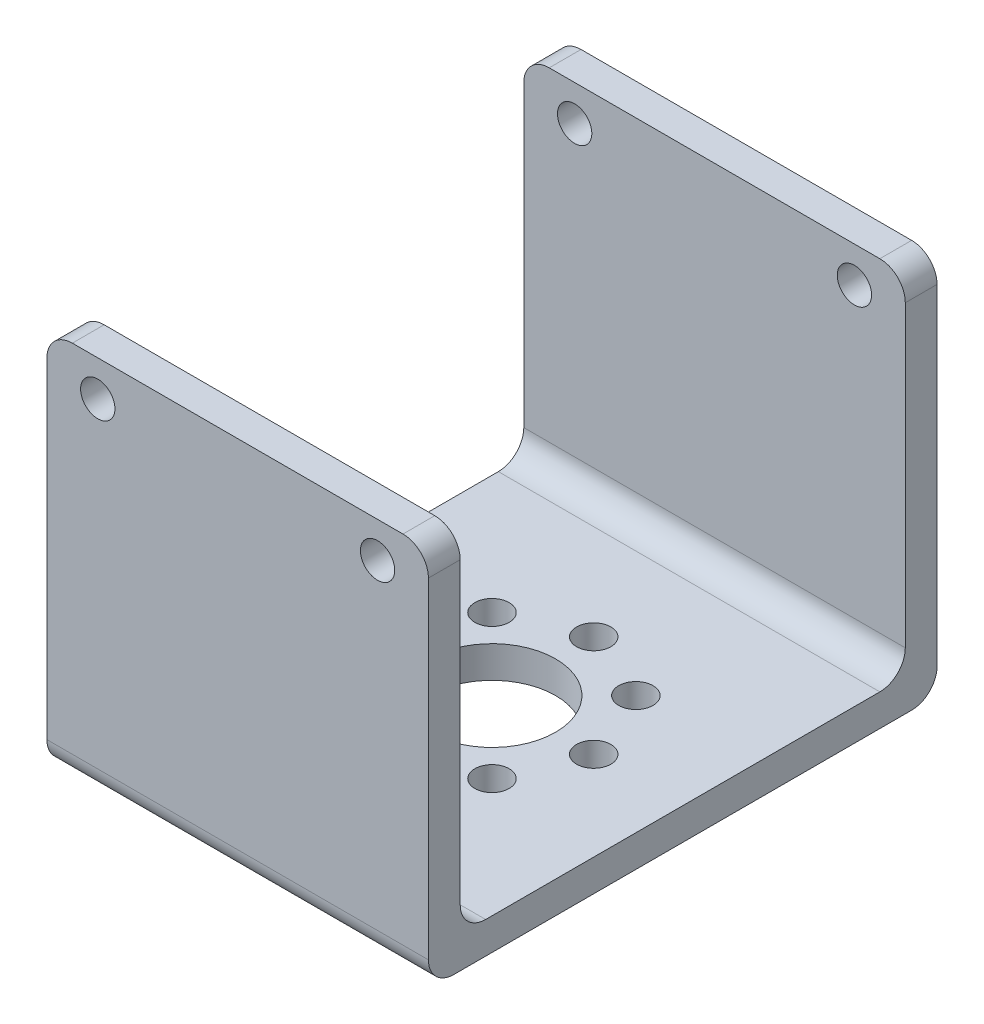
ISO-10303-21;
HEADER;
FILE_DESCRIPTION(('STEP AP214'),'2;1');
FILE_NAME('part.step','',(''),(''),'','','');
FILE_SCHEMA(('AUTOMOTIVE_DESIGN { 1 0 10303 214 1 1 1 1 }'));
ENDSEC;
DATA;
#1=APPLICATION_CONTEXT('core data for automotive mechanical design processes');
#2=APPLICATION_PROTOCOL_DEFINITION('international standard','automotive_design',2000,#1);
#3=PRODUCT_CONTEXT('',#1,'mechanical');
#4=PRODUCT('Part','Part','',(#3));
#5=PRODUCT_RELATED_PRODUCT_CATEGORY('part','',(#4));
#6=PRODUCT_DEFINITION_FORMATION('','',#4);
#7=PRODUCT_DEFINITION_CONTEXT('part definition',#1,'design');
#8=PRODUCT_DEFINITION('design','',#6,#7);
#9=PRODUCT_DEFINITION_SHAPE('','',#8);
#10=(LENGTH_UNIT() NAMED_UNIT(*) SI_UNIT(.MILLI.,.METRE.));
#11=(NAMED_UNIT(*) PLANE_ANGLE_UNIT() SI_UNIT($,.RADIAN.));
#12=(NAMED_UNIT(*) SI_UNIT($,.STERADIAN.) SOLID_ANGLE_UNIT());
#13=UNCERTAINTY_MEASURE_WITH_UNIT(LENGTH_MEASURE(1.E-05),#10,'distance_accuracy_value','');
#14=(GEOMETRIC_REPRESENTATION_CONTEXT(3) GLOBAL_UNCERTAINTY_ASSIGNED_CONTEXT((#13)) GLOBAL_UNIT_ASSIGNED_CONTEXT((#10,
#11,#12)) REPRESENTATION_CONTEXT('',''));
#15=CARTESIAN_POINT('',(0.,0.,0.));
#16=DIRECTION('',(0.,0.,1.));
#17=DIRECTION('',(1.,0.,0.));
#18=AXIS2_PLACEMENT_3D('',#15,#16,#17);
#19=CARTESIAN_POINT('',(-15.,15.,40.));
#20=DIRECTION('',(0.,-1.,0.));
#21=DIRECTION('',(0.,0.,-1.));
#22=AXIS2_PLACEMENT_3D('',#19,#20,#21);
#23=PLANE('',#22);
#24=DIRECTION('',(-1.,0.,0.));
#25=VECTOR('',#24,1.);
#26=CARTESIAN_POINT('',(-15.,15.,40.));
#27=LINE('',#26,#25);
#28=CARTESIAN_POINT('',(13.,15.,40.));
#29=VERTEX_POINT('',#28);
#30=CARTESIAN_POINT('',(-13.,15.,40.));
#31=VERTEX_POINT('',#30);
#32=EDGE_CURVE('E402',#29,#31,#27,.T.);
#33=ORIENTED_EDGE('',*,*,#32,.F.);
#34=DIRECTION('',(0.,0.,-1.));
#35=VECTOR('',#34,1.);
#36=CARTESIAN_POINT('',(13.,15.,40.));
#37=LINE('',#36,#35);
#38=CARTESIAN_POINT('',(13.,15.,37.5));
#39=VERTEX_POINT('',#38);
#40=EDGE_CURVE('E170',#29,#39,#37,.T.);
#41=ORIENTED_EDGE('',*,*,#40,.T.);
#42=DIRECTION('',(1.,0.,0.));
#43=VECTOR('',#42,1.);
#44=CARTESIAN_POINT('',(-25.,15.,37.5));
#45=LINE('',#44,#43);
#46=CARTESIAN_POINT('',(-13.,15.,37.5));
#47=VERTEX_POINT('',#46);
#48=EDGE_CURVE('E161',#47,#39,#45,.T.);
#49=ORIENTED_EDGE('',*,*,#48,.F.);
#50=DIRECTION('',(0.,0.,-1.));
#51=VECTOR('',#50,1.);
#52=CARTESIAN_POINT('',(-13.,15.,40.));
#53=LINE('',#52,#51);
#54=EDGE_CURVE('E175',#47,#31,#53,.F.);
#55=ORIENTED_EDGE('',*,*,#54,.T.);
#56=EDGE_LOOP('',(#33,#41,#49,#55));
#57=FACE_BOUND('',#56,.T.);
#58=ADVANCED_FACE('F39',(#57),#23,.F.);
#59=CARTESIAN_POINT('',(15.,15.,40.));
#60=DIRECTION('',(-1.,0.,0.));
#61=DIRECTION('',(0.,-1.,0.));
#62=AXIS2_PLACEMENT_3D('',#59,#60,#61);
#63=PLANE('',#62);
#64=DIRECTION('',(0.,1.,0.));
#65=VECTOR('',#64,1.);
#66=CARTESIAN_POINT('',(15.,15.,40.));
#67=LINE('',#66,#65);
#68=CARTESIAN_POINT('',(15.,-13.,40.));
#69=VERTEX_POINT('',#68);
#70=CARTESIAN_POINT('',(15.,13.,40.));
#71=VERTEX_POINT('',#70);
#72=EDGE_CURVE('E399',#69,#71,#67,.T.);
#73=ORIENTED_EDGE('',*,*,#72,.F.);
#74=CARTESIAN_POINT('',(15.,-13.,38.));
#75=DIRECTION('',(-1.,0.,0.));
#76=DIRECTION('',(0.,-1.,0.));
#77=AXIS2_PLACEMENT_3D('',#74,#75,#76);
#78=CIRCLE('',#77,2.);
#79=CARTESIAN_POINT('',(15.,-15.,38.));
#80=VERTEX_POINT('',#79);
#81=EDGE_CURVE('E258',#69,#80,#78,.F.);
#82=ORIENTED_EDGE('',*,*,#81,.T.);
#83=DIRECTION('',(0.,0.,-1.));
#84=VECTOR('',#83,1.);
#85=CARTESIAN_POINT('',(15.,-15.,40.));
#86=LINE('',#85,#84);
#87=CARTESIAN_POINT('',(15.,-15.,2.));
#88=VERTEX_POINT('',#87);
#89=EDGE_CURVE('E410',#80,#88,#86,.T.);
#90=ORIENTED_EDGE('',*,*,#89,.T.);
#91=CARTESIAN_POINT('',(15.,-13.,2.));
#92=DIRECTION('',(-1.,0.,0.));
#93=DIRECTION('',(0.,-1.,0.));
#94=AXIS2_PLACEMENT_3D('',#91,#92,#93);
#95=CIRCLE('',#94,2.);
#96=CARTESIAN_POINT('',(15.,-13.,0.));
#97=VERTEX_POINT('',#96);
#98=EDGE_CURVE('E255',#88,#97,#95,.F.);
#99=ORIENTED_EDGE('',*,*,#98,.T.);
#100=DIRECTION('',(0.,1.,0.));
#101=VECTOR('',#100,1.);
#102=CARTESIAN_POINT('',(15.,15.,0.));
#103=LINE('',#102,#101);
#104=CARTESIAN_POINT('',(15.,13.,0.));
#105=VERTEX_POINT('',#104);
#106=EDGE_CURVE('E179',#97,#105,#103,.T.);
#107=ORIENTED_EDGE('',*,*,#106,.T.);
#108=DIRECTION('',(0.,0.,-1.));
#109=VECTOR('',#108,1.);
#110=CARTESIAN_POINT('',(15.,13.,40.));
#111=LINE('',#110,#109);
#112=CARTESIAN_POINT('',(15.,13.,2.5));
#113=VERTEX_POINT('',#112);
#114=EDGE_CURVE('E196',#105,#113,#111,.F.);
#115=ORIENTED_EDGE('',*,*,#114,.T.);
#116=DIRECTION('',(0.,1.,0.));
#117=VECTOR('',#116,1.);
#118=CARTESIAN_POINT('',(15.,0.,2.5));
#119=LINE('',#118,#117);
#120=CARTESIAN_POINT('',(15.,-10.5,2.5));
#121=VERTEX_POINT('',#120);
#122=EDGE_CURVE('E390',#121,#113,#119,.T.);
#123=ORIENTED_EDGE('',*,*,#122,.F.);
#124=CARTESIAN_POINT('',(15.,-10.5,4.5));
#125=DIRECTION('',(-1.,0.,0.));
#126=DIRECTION('',(0.,-1.,0.));
#127=AXIS2_PLACEMENT_3D('',#124,#125,#126);
#128=CIRCLE('',#127,2.);
#129=CARTESIAN_POINT('',(15.,-12.5,4.5));
#130=VERTEX_POINT('',#129);
#131=EDGE_CURVE('E49',#121,#130,#128,.T.);
#132=ORIENTED_EDGE('',*,*,#131,.T.);
#133=DIRECTION('',(0.,0.,-1.));
#134=VECTOR('',#133,1.);
#135=CARTESIAN_POINT('',(15.,-12.5,0.));
#136=LINE('',#135,#134);
#137=CARTESIAN_POINT('',(15.,-12.5,35.5));
#138=VERTEX_POINT('',#137);
#139=EDGE_CURVE('E287',#138,#130,#136,.T.);
#140=ORIENTED_EDGE('',*,*,#139,.F.);
#141=CARTESIAN_POINT('',(15.,-10.5,35.5));
#142=DIRECTION('',(-1.,0.,0.));
#143=DIRECTION('',(0.,-1.,0.));
#144=AXIS2_PLACEMENT_3D('',#141,#142,#143);
#145=CIRCLE('',#144,2.);
#146=CARTESIAN_POINT('',(15.,-10.5,37.5));
#147=VERTEX_POINT('',#146);
#148=EDGE_CURVE('E275',#138,#147,#145,.T.);
#149=ORIENTED_EDGE('',*,*,#148,.T.);
#150=DIRECTION('',(0.,-1.,0.));
#151=VECTOR('',#150,1.);
#152=CARTESIAN_POINT('',(15.,0.,37.5));
#153=LINE('',#152,#151);
#154=CARTESIAN_POINT('',(15.,13.,37.5));
#155=VERTEX_POINT('',#154);
#156=EDGE_CURVE('E393',#155,#147,#153,.T.);
#157=ORIENTED_EDGE('',*,*,#156,.F.);
#158=DIRECTION('',(0.,0.,-1.));
#159=VECTOR('',#158,1.);
#160=CARTESIAN_POINT('',(15.,13.,40.));
#161=LINE('',#160,#159);
#162=EDGE_CURVE('E200',#155,#71,#161,.F.);
#163=ORIENTED_EDGE('',*,*,#162,.T.);
#164=EDGE_LOOP('',(#73,#82,#90,#99,#107,#115,#123,#132,#140,#149,#157,#163));
#165=FACE_BOUND('',#164,.T.);
#166=ADVANCED_FACE('F445',(#165),#63,.F.);
#167=DIRECTION('',(-1.,0.,0.));
#168=VECTOR('',#167,1.);
#169=CARTESIAN_POINT('',(-15.,15.,0.));
#170=LINE('',#169,#168);
#171=CARTESIAN_POINT('',(13.,15.,0.));
#172=VERTEX_POINT('',#171);
#173=CARTESIAN_POINT('',(-13.,15.,0.));
#174=VERTEX_POINT('',#173);
#175=EDGE_CURVE('E413',#172,#174,#170,.T.);
#176=ORIENTED_EDGE('',*,*,#175,.T.);
#177=DIRECTION('',(0.,0.,-1.));
#178=VECTOR('',#177,1.);
#179=CARTESIAN_POINT('',(-13.,15.,40.));
#180=LINE('',#179,#178);
#181=CARTESIAN_POINT('',(-13.,15.,2.5));
#182=VERTEX_POINT('',#181);
#183=EDGE_CURVE('E227',#174,#182,#180,.F.);
#184=ORIENTED_EDGE('',*,*,#183,.T.);
#185=DIRECTION('',(1.,0.,0.));
#186=VECTOR('',#185,1.);
#187=CARTESIAN_POINT('',(-25.,15.,2.5));
#188=LINE('',#187,#186);
#189=CARTESIAN_POINT('',(13.,15.,2.5));
#190=VERTEX_POINT('',#189);
#191=EDGE_CURVE('E180',#182,#190,#188,.T.);
#192=ORIENTED_EDGE('',*,*,#191,.T.);
#193=DIRECTION('',(0.,0.,-1.));
#194=VECTOR('',#193,1.);
#195=CARTESIAN_POINT('',(13.,15.,40.));
#196=LINE('',#195,#194);
#197=EDGE_CURVE('E223',#190,#172,#196,.T.);
#198=ORIENTED_EDGE('',*,*,#197,.T.);
#199=EDGE_LOOP('',(#176,#184,#192,#198));
#200=FACE_BOUND('',#199,.T.);
#201=ADVANCED_FACE('F455',(#200),#23,.F.);
#202=CARTESIAN_POINT('',(-15.,15.,40.));
#203=DIRECTION('',(1.,0.,0.));
#204=DIRECTION('',(0.,1.,0.));
#205=AXIS2_PLACEMENT_3D('',#202,#203,#204);
#206=PLANE('',#205);
#207=DIRECTION('',(0.,0.,-1.));
#208=VECTOR('',#207,1.);
#209=CARTESIAN_POINT('',(-15.,-15.,40.));
#210=LINE('',#209,#208);
#211=CARTESIAN_POINT('',(-15.,-15.,38.));
#212=VERTEX_POINT('',#211);
#213=CARTESIAN_POINT('',(-15.,-15.,2.));
#214=VERTEX_POINT('',#213);
#215=EDGE_CURVE('E422',#212,#214,#210,.T.);
#216=ORIENTED_EDGE('',*,*,#215,.F.);
#217=CARTESIAN_POINT('',(-15.,-13.,38.));
#218=DIRECTION('',(1.,0.,0.));
#219=DIRECTION('',(0.,1.,0.));
#220=AXIS2_PLACEMENT_3D('',#217,#218,#219);
#221=CIRCLE('',#220,2.);
#222=CARTESIAN_POINT('',(-15.,-13.,40.));
#223=VERTEX_POINT('',#222);
#224=EDGE_CURVE('E270',#212,#223,#221,.F.);
#225=ORIENTED_EDGE('',*,*,#224,.T.);
#226=DIRECTION('',(0.,-1.,0.));
#227=VECTOR('',#226,1.);
#228=CARTESIAN_POINT('',(-15.,15.,40.));
#229=LINE('',#228,#227);
#230=CARTESIAN_POINT('',(-15.,13.,40.));
#231=VERTEX_POINT('',#230);
#232=EDGE_CURVE('E406',#231,#223,#229,.T.);
#233=ORIENTED_EDGE('',*,*,#232,.F.);
#234=DIRECTION('',(0.,0.,-1.));
#235=VECTOR('',#234,1.);
#236=CARTESIAN_POINT('',(-15.,13.,40.));
#237=LINE('',#236,#235);
#238=CARTESIAN_POINT('',(-15.,13.,37.5));
#239=VERTEX_POINT('',#238);
#240=EDGE_CURVE('E213',#231,#239,#237,.T.);
#241=ORIENTED_EDGE('',*,*,#240,.T.);
#242=DIRECTION('',(0.,-1.,0.));
#243=VECTOR('',#242,1.);
#244=CARTESIAN_POINT('',(-15.,15.,37.5));
#245=LINE('',#244,#243);
#246=CARTESIAN_POINT('',(-15.,-10.5,37.5));
#247=VERTEX_POINT('',#246);
#248=EDGE_CURVE('E163',#239,#247,#245,.T.);
#249=ORIENTED_EDGE('',*,*,#248,.T.);
#250=CARTESIAN_POINT('',(-15.,-10.5,35.5));
#251=DIRECTION('',(1.,0.,0.));
#252=DIRECTION('',(0.,1.,0.));
#253=AXIS2_PLACEMENT_3D('',#250,#251,#252);
#254=CIRCLE('',#253,2.);
#255=CARTESIAN_POINT('',(-15.,-12.5,35.5));
#256=VERTEX_POINT('',#255);
#257=EDGE_CURVE('E278',#247,#256,#254,.T.);
#258=ORIENTED_EDGE('',*,*,#257,.T.);
#259=DIRECTION('',(0.,0.,-1.));
#260=VECTOR('',#259,1.);
#261=CARTESIAN_POINT('',(-15.,-12.5,40.));
#262=LINE('',#261,#260);
#263=CARTESIAN_POINT('',(-15.,-12.5,4.5));
#264=VERTEX_POINT('',#263);
#265=EDGE_CURVE('E190',#256,#264,#262,.T.);
#266=ORIENTED_EDGE('',*,*,#265,.T.);
#267=CARTESIAN_POINT('',(-15.,-10.5,4.5));
#268=DIRECTION('',(1.,0.,0.));
#269=DIRECTION('',(0.,1.,0.));
#270=AXIS2_PLACEMENT_3D('',#267,#268,#269);
#271=CIRCLE('',#270,2.);
#272=CARTESIAN_POINT('',(-15.,-10.5,2.5));
#273=VERTEX_POINT('',#272);
#274=EDGE_CURVE('E11',#264,#273,#271,.T.);
#275=ORIENTED_EDGE('',*,*,#274,.T.);
#276=DIRECTION('',(0.,1.,0.));
#277=VECTOR('',#276,1.);
#278=CARTESIAN_POINT('',(-15.,15.,2.5));
#279=LINE('',#278,#277);
#280=CARTESIAN_POINT('',(-15.,13.,2.5));
#281=VERTEX_POINT('',#280);
#282=EDGE_CURVE('E425',#273,#281,#279,.T.);
#283=ORIENTED_EDGE('',*,*,#282,.T.);
#284=DIRECTION('',(0.,0.,-1.));
#285=VECTOR('',#284,1.);
#286=CARTESIAN_POINT('',(-15.,13.,40.));
#287=LINE('',#286,#285);
#288=CARTESIAN_POINT('',(-15.,13.,0.));
#289=VERTEX_POINT('',#288);
#290=EDGE_CURVE('E209',#281,#289,#287,.T.);
#291=ORIENTED_EDGE('',*,*,#290,.T.);
#292=DIRECTION('',(0.,-1.,0.));
#293=VECTOR('',#292,1.);
#294=CARTESIAN_POINT('',(-15.,15.,0.));
#295=LINE('',#294,#293);
#296=CARTESIAN_POINT('',(-15.,-13.,0.));
#297=VERTEX_POINT('',#296);
#298=EDGE_CURVE('E403',#289,#297,#295,.T.);
#299=ORIENTED_EDGE('',*,*,#298,.T.);
#300=CARTESIAN_POINT('',(-15.,-13.,2.));
#301=DIRECTION('',(1.,0.,0.));
#302=DIRECTION('',(0.,1.,0.));
#303=AXIS2_PLACEMENT_3D('',#300,#301,#302);
#304=CIRCLE('',#303,2.);
#305=EDGE_CURVE('E64',#297,#214,#304,.F.);
#306=ORIENTED_EDGE('',*,*,#305,.T.);
#307=EDGE_LOOP('',(#216,#225,#233,#241,#249,#258,#266,#275,#283,#291,#299,#306));
#308=FACE_BOUND('',#307,.T.);
#309=ADVANCED_FACE('F431',(#308),#206,.F.);
#310=CARTESIAN_POINT('',(-15.,-15.,40.));
#311=DIRECTION('',(0.,1.,0.));
#312=DIRECTION('',(0.,0.,1.));
#313=AXIS2_PLACEMENT_3D('',#310,#311,#312);
#314=PLANE('',#313);
#315=CARTESIAN_POINT('',(-5.65685424949238,-15.,25.6568542494924));
#316=DIRECTION('',(0.,-1.,0.));
#317=DIRECTION('',(0.,0.,-1.));
#318=AXIS2_PLACEMENT_3D('',#315,#316,#317);
#319=CIRCLE('',#318,1.35);
#320=CARTESIAN_POINT('',(-5.65685424949238,-15.,24.3068542494924));
#321=VERTEX_POINT('',#320);
#322=EDGE_CURVE('E353',#321,#321,#319,.T.);
#323=ORIENTED_EDGE('',*,*,#322,.F.);
#324=EDGE_LOOP('',(#323));
#325=FACE_BOUND('',#324,.T.);
#326=CARTESIAN_POINT('',(-8.,-15.,20.));
#327=DIRECTION('',(0.,-1.,0.));
#328=DIRECTION('',(0.,0.,-1.));
#329=AXIS2_PLACEMENT_3D('',#326,#327,#328);
#330=CIRCLE('',#329,1.35);
#331=CARTESIAN_POINT('',(-8.,-15.,18.65));
#332=VERTEX_POINT('',#331);
#333=EDGE_CURVE('E374',#332,#332,#330,.T.);
#334=ORIENTED_EDGE('',*,*,#333,.F.);
#335=EDGE_LOOP('',(#334));
#336=FACE_BOUND('',#335,.T.);
#337=CARTESIAN_POINT('',(-5.65685425114447,-15.,14.3431457521597));
#338=DIRECTION('',(0.,-1.,0.));
#339=DIRECTION('',(0.,0.,-1.));
#340=AXIS2_PLACEMENT_3D('',#337,#338,#339);
#341=CIRCLE('',#340,1.35);
#342=CARTESIAN_POINT('',(-5.65685425114447,-15.,12.9931457521597));
#343=VERTEX_POINT('',#342);
#344=EDGE_CURVE('E370',#343,#343,#341,.T.);
#345=ORIENTED_EDGE('',*,*,#344,.F.);
#346=EDGE_LOOP('',(#345));
#347=FACE_BOUND('',#346,.T.);
#348=CARTESIAN_POINT('',(0.,-15.,12.));
#349=DIRECTION('',(0.,-1.,0.));
#350=DIRECTION('',(0.,0.,-1.));
#351=AXIS2_PLACEMENT_3D('',#348,#349,#350);
#352=CIRCLE('',#351,1.35);
#353=CARTESIAN_POINT('',(0.,-15.,10.65));
#354=VERTEX_POINT('',#353);
#355=EDGE_CURVE('E366',#354,#354,#352,.T.);
#356=ORIENTED_EDGE('',*,*,#355,.F.);
#357=EDGE_LOOP('',(#356));
#358=FACE_BOUND('',#357,.T.);
#359=CARTESIAN_POINT('',(5.65685425114447,-15.,14.3431457521597));
#360=DIRECTION('',(0.,-1.,0.));
#361=DIRECTION('',(0.,0.,-1.));
#362=AXIS2_PLACEMENT_3D('',#359,#360,#361);
#363=CIRCLE('',#362,1.35);
#364=CARTESIAN_POINT('',(5.65685425114447,-15.,12.9931457521597));
#365=VERTEX_POINT('',#364);
#366=EDGE_CURVE('E362',#365,#365,#363,.T.);
#367=ORIENTED_EDGE('',*,*,#366,.F.);
#368=EDGE_LOOP('',(#367));
#369=FACE_BOUND('',#368,.T.);
#370=CARTESIAN_POINT('',(8.,-15.,20.));
#371=DIRECTION('',(0.,-1.,0.));
#372=DIRECTION('',(0.,0.,-1.));
#373=AXIS2_PLACEMENT_3D('',#370,#371,#372);
#374=CIRCLE('',#373,1.35);
#375=CARTESIAN_POINT('',(8.,-15.,18.65));
#376=VERTEX_POINT('',#375);
#377=EDGE_CURVE('E358',#376,#376,#374,.T.);
#378=ORIENTED_EDGE('',*,*,#377,.F.);
#379=EDGE_LOOP('',(#378));
#380=FACE_BOUND('',#379,.T.);
#381=CARTESIAN_POINT('',(5.65685424949238,-15.,25.6568542494924));
#382=DIRECTION('',(0.,-1.,0.));
#383=DIRECTION('',(0.,0.,-1.));
#384=AXIS2_PLACEMENT_3D('',#381,#382,#383);
#385=CIRCLE('',#384,1.35);
#386=CARTESIAN_POINT('',(5.65685424949238,-15.,24.3068542494924));
#387=VERTEX_POINT('',#386);
#388=EDGE_CURVE('E354',#387,#387,#385,.T.);
#389=ORIENTED_EDGE('',*,*,#388,.F.);
#390=EDGE_LOOP('',(#389));
#391=FACE_BOUND('',#390,.T.);
#392=CARTESIAN_POINT('',(0.,-15.,28.));
#393=DIRECTION('',(0.,-1.,0.));
#394=DIRECTION('',(0.,0.,-1.));
#395=AXIS2_PLACEMENT_3D('',#392,#393,#394);
#396=CIRCLE('',#395,1.35);
#397=CARTESIAN_POINT('',(0.,-15.,26.65));
#398=VERTEX_POINT('',#397);
#399=EDGE_CURVE('E294',#398,#398,#396,.T.);
#400=ORIENTED_EDGE('',*,*,#399,.F.);
#401=EDGE_LOOP('',(#400));
#402=FACE_BOUND('',#401,.T.);
#403=CARTESIAN_POINT('',(0.,-15.,20.));
#404=DIRECTION('',(0.,-1.,0.));
#405=DIRECTION('',(0.,0.,-1.));
#406=AXIS2_PLACEMENT_3D('',#403,#404,#405);
#407=CIRCLE('',#406,5.);
#408=CARTESIAN_POINT('',(0.,-15.,15.));
#409=VERTEX_POINT('',#408);
#410=EDGE_CURVE('E288',#409,#409,#407,.T.);
#411=ORIENTED_EDGE('',*,*,#410,.F.);
#412=EDGE_LOOP('',(#411));
#413=FACE_BOUND('',#412,.T.);
#414=ORIENTED_EDGE('',*,*,#89,.F.);
#415=DIRECTION('',(1.,0.,0.));
#416=VECTOR('',#415,1.);
#417=CARTESIAN_POINT('',(-15.,-15.,38.));
#418=LINE('',#417,#416);
#419=EDGE_CURVE('E265',#80,#212,#418,.F.);
#420=ORIENTED_EDGE('',*,*,#419,.T.);
#421=ORIENTED_EDGE('',*,*,#215,.T.);
#422=DIRECTION('',(1.,0.,0.));
#423=VECTOR('',#422,1.);
#424=CARTESIAN_POINT('',(-15.,-15.,2.));
#425=LINE('',#424,#423);
#426=EDGE_CURVE('E261',#214,#88,#425,.T.);
#427=ORIENTED_EDGE('',*,*,#426,.T.);
#428=EDGE_LOOP('',(#414,#420,#421,#427));
#429=FACE_BOUND('',#428,.T.);
#430=ADVANCED_FACE('F466',(#325,#336,#347,#358,#369,#380,#391,#402,#413,#429),#314,.F.);
#431=CARTESIAN_POINT('',(0.,0.,40.));
#432=DIRECTION('',(0.,0.,1.));
#433=DIRECTION('',(1.,0.,0.));
#434=AXIS2_PLACEMENT_3D('',#431,#432,#433);
#435=PLANE('',#434);
#436=CARTESIAN_POINT('',(11.,12.2,40.));
#437=DIRECTION('',(0.,0.,-1.));
#438=DIRECTION('',(-1.,0.,0.));
#439=AXIS2_PLACEMENT_3D('',#436,#437,#438);
#440=CIRCLE('',#439,1.35);
#441=CARTESIAN_POINT('',(9.65,12.2,40.));
#442=VERTEX_POINT('',#441);
#443=EDGE_CURVE('E325',#442,#442,#440,.T.);
#444=ORIENTED_EDGE('',*,*,#443,.T.);
#445=EDGE_LOOP('',(#444));
#446=FACE_BOUND('',#445,.T.);
#447=CARTESIAN_POINT('',(-11.,12.2,40.));
#448=DIRECTION('',(0.,0.,-1.));
#449=DIRECTION('',(-1.,0.,0.));
#450=AXIS2_PLACEMENT_3D('',#447,#448,#449);
#451=CIRCLE('',#450,1.35);
#452=CARTESIAN_POINT('',(-12.35,12.2,40.));
#453=VERTEX_POINT('',#452);
#454=EDGE_CURVE('E339',#453,#453,#451,.T.);
#455=ORIENTED_EDGE('',*,*,#454,.T.);
#456=EDGE_LOOP('',(#455));
#457=FACE_BOUND('',#456,.T.);
#458=ORIENTED_EDGE('',*,*,#232,.T.);
#459=DIRECTION('',(1.,0.,0.));
#460=VECTOR('',#459,1.);
#461=CARTESIAN_POINT('',(15.,-13.,40.));
#462=LINE('',#461,#460);
#463=EDGE_CURVE('E251',#223,#69,#462,.T.);
#464=ORIENTED_EDGE('',*,*,#463,.T.);
#465=ORIENTED_EDGE('',*,*,#72,.T.);
#466=CARTESIAN_POINT('',(13.,13.,40.));
#467=DIRECTION('',(0.,0.,1.));
#468=DIRECTION('',(1.,0.,0.));
#469=AXIS2_PLACEMENT_3D('',#466,#467,#468);
#470=CIRCLE('',#469,2.);
#471=EDGE_CURVE('E206',#71,#29,#470,.T.);
#472=ORIENTED_EDGE('',*,*,#471,.T.);
#473=ORIENTED_EDGE('',*,*,#32,.T.);
#474=CARTESIAN_POINT('',(-13.,13.,40.));
#475=DIRECTION('',(0.,0.,1.));
#476=DIRECTION('',(1.,0.,0.));
#477=AXIS2_PLACEMENT_3D('',#474,#475,#476);
#478=CIRCLE('',#477,2.);
#479=EDGE_CURVE('E184',#31,#231,#478,.T.);
#480=ORIENTED_EDGE('',*,*,#479,.T.);
#481=EDGE_LOOP('',(#458,#464,#465,#472,#473,#480));
#482=FACE_BOUND('',#481,.T.);
#483=ADVANCED_FACE('F473',(#446,#457,#482),#435,.T.);
#484=CARTESIAN_POINT('',(0.,0.,0.));
#485=DIRECTION('',(0.,0.,1.));
#486=DIRECTION('',(1.,0.,0.));
#487=AXIS2_PLACEMENT_3D('',#484,#485,#486);
#488=PLANE('',#487);
#489=CARTESIAN_POINT('',(11.,12.2,0.));
#490=DIRECTION('',(0.,0.,-1.));
#491=DIRECTION('',(-1.,0.,0.));
#492=AXIS2_PLACEMENT_3D('',#489,#490,#491);
#493=CIRCLE('',#492,1.35);
#494=CARTESIAN_POINT('',(9.65,12.2,0.));
#495=VERTEX_POINT('',#494);
#496=EDGE_CURVE('E333',#495,#495,#493,.T.);
#497=ORIENTED_EDGE('',*,*,#496,.F.);
#498=EDGE_LOOP('',(#497));
#499=FACE_BOUND('',#498,.T.);
#500=CARTESIAN_POINT('',(-11.,12.2,0.));
#501=DIRECTION('',(0.,0.,-1.));
#502=DIRECTION('',(-1.,0.,0.));
#503=AXIS2_PLACEMENT_3D('',#500,#501,#502);
#504=CIRCLE('',#503,1.35);
#505=CARTESIAN_POINT('',(-12.35,12.2,0.));
#506=VERTEX_POINT('',#505);
#507=EDGE_CURVE('E345',#506,#506,#504,.T.);
#508=ORIENTED_EDGE('',*,*,#507,.F.);
#509=EDGE_LOOP('',(#508));
#510=FACE_BOUND('',#509,.T.);
#511=ORIENTED_EDGE('',*,*,#106,.F.);
#512=DIRECTION('',(1.,0.,0.));
#513=VECTOR('',#512,1.);
#514=CARTESIAN_POINT('',(0.,-13.,0.));
#515=LINE('',#514,#513);
#516=EDGE_CURVE('E57',#97,#297,#515,.F.);
#517=ORIENTED_EDGE('',*,*,#516,.T.);
#518=ORIENTED_EDGE('',*,*,#298,.F.);
#519=CARTESIAN_POINT('',(-13.,13.,0.));
#520=DIRECTION('',(0.,0.,1.));
#521=DIRECTION('',(1.,0.,0.));
#522=AXIS2_PLACEMENT_3D('',#519,#520,#521);
#523=CIRCLE('',#522,2.);
#524=EDGE_CURVE('E220',#289,#174,#523,.F.);
#525=ORIENTED_EDGE('',*,*,#524,.T.);
#526=ORIENTED_EDGE('',*,*,#175,.F.);
#527=CARTESIAN_POINT('',(13.,13.,0.));
#528=DIRECTION('',(0.,0.,1.));
#529=DIRECTION('',(1.,0.,0.));
#530=AXIS2_PLACEMENT_3D('',#527,#528,#529);
#531=CIRCLE('',#530,2.);
#532=EDGE_CURVE('E216',#172,#105,#531,.F.);
#533=ORIENTED_EDGE('',*,*,#532,.T.);
#534=EDGE_LOOP('',(#511,#517,#518,#525,#526,#533));
#535=FACE_BOUND('',#534,.T.);
#536=ADVANCED_FACE('F461',(#499,#510,#535),#488,.F.);
#537=CARTESIAN_POINT('',(-25.,-12.5,0.));
#538=DIRECTION('',(0.,-1.,0.));
#539=DIRECTION('',(1.,0.,0.));
#540=AXIS2_PLACEMENT_3D('',#537,#538,#539);
#541=PLANE('',#540);
#542=CARTESIAN_POINT('',(-5.65685424949238,-12.5,25.6568542494924));
#543=DIRECTION('',(0.,-1.,0.));
#544=DIRECTION('',(1.,0.,0.));
#545=AXIS2_PLACEMENT_3D('',#542,#543,#544);
#546=CIRCLE('',#545,1.35);
#547=CARTESIAN_POINT('',(-4.30685424949238,-12.5,25.6568542494924));
#548=VERTEX_POINT('',#547);
#549=EDGE_CURVE('E318',#548,#548,#546,.T.);
#550=ORIENTED_EDGE('',*,*,#549,.T.);
#551=EDGE_LOOP('',(#550));
#552=FACE_BOUND('',#551,.T.);
#553=CARTESIAN_POINT('',(-8.,-12.5,20.));
#554=DIRECTION('',(0.,-1.,0.));
#555=DIRECTION('',(1.,0.,0.));
#556=AXIS2_PLACEMENT_3D('',#553,#554,#555);
#557=CIRCLE('',#556,1.35);
#558=CARTESIAN_POINT('',(-6.65,-12.5,20.));
#559=VERTEX_POINT('',#558);
#560=EDGE_CURVE('E314',#559,#559,#557,.T.);
#561=ORIENTED_EDGE('',*,*,#560,.T.);
#562=EDGE_LOOP('',(#561));
#563=FACE_BOUND('',#562,.T.);
#564=CARTESIAN_POINT('',(-5.65685425114447,-12.5,14.3431457521597));
#565=DIRECTION('',(0.,-1.,0.));
#566=DIRECTION('',(1.,0.,0.));
#567=AXIS2_PLACEMENT_3D('',#564,#565,#566);
#568=CIRCLE('',#567,1.35);
#569=CARTESIAN_POINT('',(-4.30685425114447,-12.5,14.3431457521597));
#570=VERTEX_POINT('',#569);
#571=EDGE_CURVE('E310',#570,#570,#568,.T.);
#572=ORIENTED_EDGE('',*,*,#571,.T.);
#573=EDGE_LOOP('',(#572));
#574=FACE_BOUND('',#573,.T.);
#575=CARTESIAN_POINT('',(0.,-12.5,12.));
#576=DIRECTION('',(0.,-1.,0.));
#577=DIRECTION('',(1.,0.,0.));
#578=AXIS2_PLACEMENT_3D('',#575,#576,#577);
#579=CIRCLE('',#578,1.35);
#580=CARTESIAN_POINT('',(1.35,-12.5,12.));
#581=VERTEX_POINT('',#580);
#582=EDGE_CURVE('E306',#581,#581,#579,.T.);
#583=ORIENTED_EDGE('',*,*,#582,.T.);
#584=EDGE_LOOP('',(#583));
#585=FACE_BOUND('',#584,.T.);
#586=CARTESIAN_POINT('',(5.65685425114447,-12.5,14.3431457521597));
#587=DIRECTION('',(0.,-1.,0.));
#588=DIRECTION('',(1.,0.,0.));
#589=AXIS2_PLACEMENT_3D('',#586,#587,#588);
#590=CIRCLE('',#589,1.35);
#591=CARTESIAN_POINT('',(7.00685425114447,-12.5,14.3431457521597));
#592=VERTEX_POINT('',#591);
#593=EDGE_CURVE('E302',#592,#592,#590,.T.);
#594=ORIENTED_EDGE('',*,*,#593,.T.);
#595=EDGE_LOOP('',(#594));
#596=FACE_BOUND('',#595,.T.);
#597=CARTESIAN_POINT('',(8.,-12.5,20.));
#598=DIRECTION('',(0.,-1.,0.));
#599=DIRECTION('',(1.,0.,0.));
#600=AXIS2_PLACEMENT_3D('',#597,#598,#599);
#601=CIRCLE('',#600,1.35);
#602=CARTESIAN_POINT('',(9.35,-12.5,20.));
#603=VERTEX_POINT('',#602);
#604=EDGE_CURVE('E298',#603,#603,#601,.T.);
#605=ORIENTED_EDGE('',*,*,#604,.T.);
#606=EDGE_LOOP('',(#605));
#607=FACE_BOUND('',#606,.T.);
#608=CARTESIAN_POINT('',(5.65685424949238,-12.5,25.6568542494924));
#609=DIRECTION('',(0.,-1.,0.));
#610=DIRECTION('',(1.,0.,0.));
#611=AXIS2_PLACEMENT_3D('',#608,#609,#610);
#612=CIRCLE('',#611,1.35);
#613=CARTESIAN_POINT('',(7.00685424949238,-12.5,25.6568542494924));
#614=VERTEX_POINT('',#613);
#615=EDGE_CURVE('E293',#614,#614,#612,.T.);
#616=ORIENTED_EDGE('',*,*,#615,.T.);
#617=EDGE_LOOP('',(#616));
#618=FACE_BOUND('',#617,.T.);
#619=CARTESIAN_POINT('',(0.,-12.5,28.));
#620=DIRECTION('',(0.,-1.,0.));
#621=DIRECTION('',(1.,0.,0.));
#622=AXIS2_PLACEMENT_3D('',#619,#620,#621);
#623=CIRCLE('',#622,1.35);
#624=CARTESIAN_POINT('',(1.35,-12.5,28.));
#625=VERTEX_POINT('',#624);
#626=EDGE_CURVE('E289',#625,#625,#623,.T.);
#627=ORIENTED_EDGE('',*,*,#626,.T.);
#628=EDGE_LOOP('',(#627));
#629=FACE_BOUND('',#628,.T.);
#630=CARTESIAN_POINT('',(0.,-12.5,20.));
#631=DIRECTION('',(0.,-1.,0.));
#632=DIRECTION('',(1.,0.,0.));
#633=AXIS2_PLACEMENT_3D('',#630,#631,#632);
#634=CIRCLE('',#633,5.);
#635=CARTESIAN_POINT('',(5.,-12.5,20.));
#636=VERTEX_POINT('',#635);
#637=EDGE_CURVE('E283',#636,#636,#634,.T.);
#638=ORIENTED_EDGE('',*,*,#637,.T.);
#639=EDGE_LOOP('',(#638));
#640=FACE_BOUND('',#639,.T.);
#641=ORIENTED_EDGE('',*,*,#265,.F.);
#642=DIRECTION('',(1.,0.,0.));
#643=VECTOR('',#642,1.);
#644=CARTESIAN_POINT('',(15.,-12.5,35.5));
#645=LINE('',#644,#643);
#646=EDGE_CURVE('E240',#256,#138,#645,.T.);
#647=ORIENTED_EDGE('',*,*,#646,.T.);
#648=ORIENTED_EDGE('',*,*,#139,.T.);
#649=DIRECTION('',(1.,0.,0.));
#650=VECTOR('',#649,1.);
#651=CARTESIAN_POINT('',(-15.,-12.5,4.5));
#652=LINE('',#651,#650);
#653=EDGE_CURVE('E237',#130,#264,#652,.F.);
#654=ORIENTED_EDGE('',*,*,#653,.T.);
#655=EDGE_LOOP('',(#641,#647,#648,#654));
#656=FACE_BOUND('',#655,.T.);
#657=ADVANCED_FACE('F478',(#552,#563,#574,#585,#596,#607,#618,#629,#640,#656),#541,.F.);
#658=CARTESIAN_POINT('',(-25.,0.,37.5));
#659=DIRECTION('',(0.,0.,1.));
#660=DIRECTION('',(1.,0.,0.));
#661=AXIS2_PLACEMENT_3D('',#658,#659,#660);
#662=PLANE('',#661);
#663=CARTESIAN_POINT('',(11.,12.2,37.5));
#664=DIRECTION('',(0.,0.,1.));
#665=DIRECTION('',(1.,0.,0.));
#666=AXIS2_PLACEMENT_3D('',#663,#664,#665);
#667=CIRCLE('',#666,1.35);
#668=CARTESIAN_POINT('',(12.35,12.2,37.5));
#669=VERTEX_POINT('',#668);
#670=EDGE_CURVE('E349',#669,#669,#667,.T.);
#671=ORIENTED_EDGE('',*,*,#670,.T.);
#672=EDGE_LOOP('',(#671));
#673=FACE_BOUND('',#672,.T.);
#674=CARTESIAN_POINT('',(-11.,12.2,37.5));
#675=DIRECTION('',(0.,0.,1.));
#676=DIRECTION('',(1.,0.,0.));
#677=AXIS2_PLACEMENT_3D('',#674,#675,#676);
#678=CIRCLE('',#677,1.35);
#679=CARTESIAN_POINT('',(-9.65,12.2,37.5));
#680=VERTEX_POINT('',#679);
#681=EDGE_CURVE('E324',#680,#680,#678,.T.);
#682=ORIENTED_EDGE('',*,*,#681,.T.);
#683=EDGE_LOOP('',(#682));
#684=FACE_BOUND('',#683,.T.);
#685=ORIENTED_EDGE('',*,*,#156,.T.);
#686=DIRECTION('',(1.,0.,0.));
#687=VECTOR('',#686,1.);
#688=CARTESIAN_POINT('',(-15.,-10.5,37.5));
#689=LINE('',#688,#687);
#690=EDGE_CURVE('E244',#147,#247,#689,.F.);
#691=ORIENTED_EDGE('',*,*,#690,.T.);
#692=ORIENTED_EDGE('',*,*,#248,.F.);
#693=CARTESIAN_POINT('',(-13.,13.,37.5));
#694=DIRECTION('',(0.,0.,1.));
#695=DIRECTION('',(1.,0.,0.));
#696=AXIS2_PLACEMENT_3D('',#693,#694,#695);
#697=CIRCLE('',#696,2.);
#698=EDGE_CURVE('E157',#239,#47,#697,.F.);
#699=ORIENTED_EDGE('',*,*,#698,.T.);
#700=ORIENTED_EDGE('',*,*,#48,.T.);
#701=CARTESIAN_POINT('',(13.,13.,37.5));
#702=DIRECTION('',(0.,0.,1.));
#703=DIRECTION('',(1.,0.,0.));
#704=AXIS2_PLACEMENT_3D('',#701,#702,#703);
#705=CIRCLE('',#704,2.);
#706=EDGE_CURVE('E169',#39,#155,#705,.F.);
#707=ORIENTED_EDGE('',*,*,#706,.T.);
#708=EDGE_LOOP('',(#685,#691,#692,#699,#700,#707));
#709=FACE_BOUND('',#708,.T.);
#710=ADVANCED_FACE('F160',(#673,#684,#709),#662,.F.);
#711=CARTESIAN_POINT('',(-25.,0.,2.5));
#712=DIRECTION('',(0.,0.,-1.));
#713=DIRECTION('',(-1.,0.,0.));
#714=AXIS2_PLACEMENT_3D('',#711,#712,#713);
#715=PLANE('',#714);
#716=CARTESIAN_POINT('',(11.,12.2,2.5));
#717=DIRECTION('',(0.,0.,-1.));
#718=DIRECTION('',(-1.,0.,0.));
#719=AXIS2_PLACEMENT_3D('',#716,#717,#718);
#720=CIRCLE('',#719,1.35);
#721=CARTESIAN_POINT('',(9.65,12.2,2.5));
#722=VERTEX_POINT('',#721);
#723=EDGE_CURVE('E43',#722,#722,#720,.T.);
#724=ORIENTED_EDGE('',*,*,#723,.T.);
#725=EDGE_LOOP('',(#724));
#726=FACE_BOUND('',#725,.T.);
#727=CARTESIAN_POINT('',(-11.,12.2,2.5));
#728=DIRECTION('',(0.,0.,-1.));
#729=DIRECTION('',(-1.,0.,0.));
#730=AXIS2_PLACEMENT_3D('',#727,#728,#729);
#731=CIRCLE('',#730,1.35);
#732=CARTESIAN_POINT('',(-12.35,12.2,2.5));
#733=VERTEX_POINT('',#732);
#734=EDGE_CURVE('E321',#733,#733,#731,.T.);
#735=ORIENTED_EDGE('',*,*,#734,.T.);
#736=EDGE_LOOP('',(#735));
#737=FACE_BOUND('',#736,.T.);
#738=ORIENTED_EDGE('',*,*,#282,.F.);
#739=DIRECTION('',(1.,0.,0.));
#740=VECTOR('',#739,1.);
#741=CARTESIAN_POINT('',(15.,-10.5,2.5));
#742=LINE('',#741,#740);
#743=EDGE_CURVE('E247',#273,#121,#742,.T.);
#744=ORIENTED_EDGE('',*,*,#743,.T.);
#745=ORIENTED_EDGE('',*,*,#122,.T.);
#746=CARTESIAN_POINT('',(13.,13.,2.5));
#747=DIRECTION('',(0.,0.,-1.));
#748=DIRECTION('',(-1.,0.,0.));
#749=AXIS2_PLACEMENT_3D('',#746,#747,#748);
#750=CIRCLE('',#749,2.);
#751=EDGE_CURVE('E230',#113,#190,#750,.F.);
#752=ORIENTED_EDGE('',*,*,#751,.T.);
#753=ORIENTED_EDGE('',*,*,#191,.F.);
#754=CARTESIAN_POINT('',(-13.,13.,2.5));
#755=DIRECTION('',(0.,0.,-1.));
#756=DIRECTION('',(-1.,0.,0.));
#757=AXIS2_PLACEMENT_3D('',#754,#755,#756);
#758=CIRCLE('',#757,2.);
#759=EDGE_CURVE('E233',#182,#281,#758,.F.);
#760=ORIENTED_EDGE('',*,*,#759,.T.);
#761=EDGE_LOOP('',(#738,#744,#745,#752,#753,#760));
#762=FACE_BOUND('',#761,.T.);
#763=ADVANCED_FACE('F442',(#726,#737,#762),#715,.F.);
#764=CARTESIAN_POINT('',(13.,13.,40.));
#765=DIRECTION('',(0.,0.,-1.));
#766=DIRECTION('',(-1.,0.,0.));
#767=AXIS2_PLACEMENT_3D('',#764,#765,#766);
#768=CYLINDRICAL_SURFACE('',#767,2.);
#769=ORIENTED_EDGE('',*,*,#471,.F.);
#770=ORIENTED_EDGE('',*,*,#162,.F.);
#771=ORIENTED_EDGE('',*,*,#706,.F.);
#772=ORIENTED_EDGE('',*,*,#40,.F.);
#773=EDGE_LOOP('',(#769,#770,#771,#772));
#774=FACE_BOUND('',#773,.T.);
#775=ADVANCED_FACE('F483',(#774),#768,.T.);
#776=CARTESIAN_POINT('',(-13.,13.,40.));
#777=DIRECTION('',(0.,0.,-1.));
#778=DIRECTION('',(-1.,0.,0.));
#779=AXIS2_PLACEMENT_3D('',#776,#777,#778);
#780=CYLINDRICAL_SURFACE('',#779,2.);
#781=ORIENTED_EDGE('',*,*,#479,.F.);
#782=ORIENTED_EDGE('',*,*,#54,.F.);
#783=ORIENTED_EDGE('',*,*,#698,.F.);
#784=ORIENTED_EDGE('',*,*,#240,.F.);
#785=EDGE_LOOP('',(#781,#782,#783,#784));
#786=FACE_BOUND('',#785,.T.);
#787=ADVANCED_FACE('F183',(#786),#780,.T.);
#788=CARTESIAN_POINT('',(-13.,13.,40.));
#789=DIRECTION('',(0.,0.,-1.));
#790=DIRECTION('',(-1.,0.,0.));
#791=AXIS2_PLACEMENT_3D('',#788,#789,#790);
#792=CYLINDRICAL_SURFACE('',#791,2.);
#793=ORIENTED_EDGE('',*,*,#759,.F.);
#794=ORIENTED_EDGE('',*,*,#183,.F.);
#795=ORIENTED_EDGE('',*,*,#524,.F.);
#796=ORIENTED_EDGE('',*,*,#290,.F.);
#797=EDGE_LOOP('',(#793,#794,#795,#796));
#798=FACE_BOUND('',#797,.T.);
#799=ADVANCED_FACE('F459',(#798),#792,.T.);
#800=CARTESIAN_POINT('',(13.,13.,40.));
#801=DIRECTION('',(0.,0.,-1.));
#802=DIRECTION('',(-1.,0.,0.));
#803=AXIS2_PLACEMENT_3D('',#800,#801,#802);
#804=CYLINDRICAL_SURFACE('',#803,2.);
#805=ORIENTED_EDGE('',*,*,#751,.F.);
#806=ORIENTED_EDGE('',*,*,#114,.F.);
#807=ORIENTED_EDGE('',*,*,#532,.F.);
#808=ORIENTED_EDGE('',*,*,#197,.F.);
#809=EDGE_LOOP('',(#805,#806,#807,#808));
#810=FACE_BOUND('',#809,.T.);
#811=ADVANCED_FACE('F451',(#810),#804,.T.);
#812=CARTESIAN_POINT('',(-25.,-10.5,35.5));
#813=DIRECTION('',(-1.,0.,0.));
#814=DIRECTION('',(0.,-1.,0.));
#815=AXIS2_PLACEMENT_3D('',#812,#813,#814);
#816=CYLINDRICAL_SURFACE('',#815,2.);
#817=ORIENTED_EDGE('',*,*,#257,.F.);
#818=ORIENTED_EDGE('',*,*,#690,.F.);
#819=ORIENTED_EDGE('',*,*,#148,.F.);
#820=ORIENTED_EDGE('',*,*,#646,.F.);
#821=EDGE_LOOP('',(#817,#818,#819,#820));
#822=FACE_BOUND('',#821,.T.);
#823=ADVANCED_FACE('F477',(#822),#816,.F.);
#824=CARTESIAN_POINT('',(-25.,-10.5,4.5));
#825=DIRECTION('',(-1.,0.,0.));
#826=DIRECTION('',(0.,-1.,0.));
#827=AXIS2_PLACEMENT_3D('',#824,#825,#826);
#828=CYLINDRICAL_SURFACE('',#827,2.);
#829=ORIENTED_EDGE('',*,*,#274,.F.);
#830=ORIENTED_EDGE('',*,*,#653,.F.);
#831=ORIENTED_EDGE('',*,*,#131,.F.);
#832=ORIENTED_EDGE('',*,*,#743,.F.);
#833=EDGE_LOOP('',(#829,#830,#831,#832));
#834=FACE_BOUND('',#833,.T.);
#835=ADVANCED_FACE('F439',(#834),#828,.F.);
#836=CARTESIAN_POINT('',(0.,-13.,38.));
#837=DIRECTION('',(-1.,0.,0.));
#838=DIRECTION('',(0.,0.,1.));
#839=AXIS2_PLACEMENT_3D('',#836,#837,#838);
#840=CYLINDRICAL_SURFACE('',#839,2.);
#841=ORIENTED_EDGE('',*,*,#224,.F.);
#842=ORIENTED_EDGE('',*,*,#419,.F.);
#843=ORIENTED_EDGE('',*,*,#81,.F.);
#844=ORIENTED_EDGE('',*,*,#463,.F.);
#845=EDGE_LOOP('',(#841,#842,#843,#844));
#846=FACE_BOUND('',#845,.T.);
#847=ADVANCED_FACE('F471',(#846),#840,.T.);
#848=CARTESIAN_POINT('',(-15.,-13.,2.));
#849=DIRECTION('',(1.,0.,0.));
#850=DIRECTION('',(0.,0.,-1.));
#851=AXIS2_PLACEMENT_3D('',#848,#849,#850);
#852=CYLINDRICAL_SURFACE('',#851,2.);
#853=ORIENTED_EDGE('',*,*,#305,.F.);
#854=ORIENTED_EDGE('',*,*,#516,.F.);
#855=ORIENTED_EDGE('',*,*,#98,.F.);
#856=ORIENTED_EDGE('',*,*,#426,.F.);
#857=EDGE_LOOP('',(#853,#854,#855,#856));
#858=FACE_BOUND('',#857,.T.);
#859=ADVANCED_FACE('F41',(#858),#852,.T.);
#860=CARTESIAN_POINT('',(0.,15.,20.));
#861=DIRECTION('',(0.,-1.,0.));
#862=DIRECTION('',(0.,0.,-1.));
#863=AXIS2_PLACEMENT_3D('',#860,#861,#862);
#864=CYLINDRICAL_SURFACE('',#863,5.);
#865=ORIENTED_EDGE('',*,*,#410,.T.);
#866=EDGE_LOOP('',(#865));
#867=FACE_BOUND('',#866,.T.);
#868=ORIENTED_EDGE('',*,*,#637,.F.);
#869=EDGE_LOOP('',(#868));
#870=FACE_BOUND('',#869,.T.);
#871=ADVANCED_FACE('F521',(#867,#870),#864,.F.);
#872=CARTESIAN_POINT('',(0.,15.,28.));
#873=DIRECTION('',(0.,-1.,0.));
#874=DIRECTION('',(0.,0.,-1.));
#875=AXIS2_PLACEMENT_3D('',#872,#873,#874);
#876=CYLINDRICAL_SURFACE('',#875,1.35);
#877=ORIENTED_EDGE('',*,*,#399,.T.);
#878=EDGE_LOOP('',(#877));
#879=FACE_BOUND('',#878,.T.);
#880=ORIENTED_EDGE('',*,*,#626,.F.);
#881=EDGE_LOOP('',(#880));
#882=FACE_BOUND('',#881,.T.);
#883=ADVANCED_FACE('F524',(#879,#882),#876,.F.);
#884=CARTESIAN_POINT('',(5.65685424949238,15.,25.6568542494924));
#885=DIRECTION('',(0.,-1.,0.));
#886=DIRECTION('',(0.,0.,-1.));
#887=AXIS2_PLACEMENT_3D('',#884,#885,#886);
#888=CYLINDRICAL_SURFACE('',#887,1.35);
#889=ORIENTED_EDGE('',*,*,#388,.T.);
#890=EDGE_LOOP('',(#889));
#891=FACE_BOUND('',#890,.T.);
#892=ORIENTED_EDGE('',*,*,#615,.F.);
#893=EDGE_LOOP('',(#892));
#894=FACE_BOUND('',#893,.T.);
#895=ADVANCED_FACE('F528',(#891,#894),#888,.F.);
#896=CARTESIAN_POINT('',(8.,15.,20.));
#897=DIRECTION('',(0.,-1.,0.));
#898=DIRECTION('',(0.,0.,-1.));
#899=AXIS2_PLACEMENT_3D('',#896,#897,#898);
#900=CYLINDRICAL_SURFACE('',#899,1.35);
#901=ORIENTED_EDGE('',*,*,#377,.T.);
#902=EDGE_LOOP('',(#901));
#903=FACE_BOUND('',#902,.T.);
#904=ORIENTED_EDGE('',*,*,#604,.F.);
#905=EDGE_LOOP('',(#904));
#906=FACE_BOUND('',#905,.T.);
#907=ADVANCED_FACE('F550',(#903,#906),#900,.F.);
#908=CARTESIAN_POINT('',(5.65685425114447,15.,14.3431457521597));
#909=DIRECTION('',(0.,-1.,0.));
#910=DIRECTION('',(0.,0.,-1.));
#911=AXIS2_PLACEMENT_3D('',#908,#909,#910);
#912=CYLINDRICAL_SURFACE('',#911,1.35);
#913=ORIENTED_EDGE('',*,*,#366,.T.);
#914=EDGE_LOOP('',(#913));
#915=FACE_BOUND('',#914,.T.);
#916=ORIENTED_EDGE('',*,*,#593,.F.);
#917=EDGE_LOOP('',(#916));
#918=FACE_BOUND('',#917,.T.);
#919=ADVANCED_FACE('F546',(#915,#918),#912,.F.);
#920=CARTESIAN_POINT('',(0.,15.,12.));
#921=DIRECTION('',(0.,-1.,0.));
#922=DIRECTION('',(0.,0.,-1.));
#923=AXIS2_PLACEMENT_3D('',#920,#921,#922);
#924=CYLINDRICAL_SURFACE('',#923,1.35);
#925=ORIENTED_EDGE('',*,*,#355,.T.);
#926=EDGE_LOOP('',(#925));
#927=FACE_BOUND('',#926,.T.);
#928=ORIENTED_EDGE('',*,*,#582,.F.);
#929=EDGE_LOOP('',(#928));
#930=FACE_BOUND('',#929,.T.);
#931=ADVANCED_FACE('F542',(#927,#930),#924,.F.);
#932=CARTESIAN_POINT('',(-5.65685425114447,15.,14.3431457521597));
#933=DIRECTION('',(0.,-1.,0.));
#934=DIRECTION('',(0.,0.,-1.));
#935=AXIS2_PLACEMENT_3D('',#932,#933,#934);
#936=CYLINDRICAL_SURFACE('',#935,1.35);
#937=ORIENTED_EDGE('',*,*,#344,.T.);
#938=EDGE_LOOP('',(#937));
#939=FACE_BOUND('',#938,.T.);
#940=ORIENTED_EDGE('',*,*,#571,.F.);
#941=EDGE_LOOP('',(#940));
#942=FACE_BOUND('',#941,.T.);
#943=ADVANCED_FACE('F538',(#939,#942),#936,.F.);
#944=CARTESIAN_POINT('',(-8.,15.,20.));
#945=DIRECTION('',(0.,-1.,0.));
#946=DIRECTION('',(0.,0.,-1.));
#947=AXIS2_PLACEMENT_3D('',#944,#945,#946);
#948=CYLINDRICAL_SURFACE('',#947,1.35);
#949=ORIENTED_EDGE('',*,*,#333,.T.);
#950=EDGE_LOOP('',(#949));
#951=FACE_BOUND('',#950,.T.);
#952=ORIENTED_EDGE('',*,*,#560,.F.);
#953=EDGE_LOOP('',(#952));
#954=FACE_BOUND('',#953,.T.);
#955=ADVANCED_FACE('F534',(#951,#954),#948,.F.);
#956=CARTESIAN_POINT('',(-5.65685424949238,15.,25.6568542494924));
#957=DIRECTION('',(0.,-1.,0.));
#958=DIRECTION('',(0.,0.,-1.));
#959=AXIS2_PLACEMENT_3D('',#956,#957,#958);
#960=CYLINDRICAL_SURFACE('',#959,1.35);
#961=ORIENTED_EDGE('',*,*,#322,.T.);
#962=EDGE_LOOP('',(#961));
#963=FACE_BOUND('',#962,.T.);
#964=ORIENTED_EDGE('',*,*,#549,.F.);
#965=EDGE_LOOP('',(#964));
#966=FACE_BOUND('',#965,.T.);
#967=ADVANCED_FACE('F530',(#963,#966),#960,.F.);
#968=CARTESIAN_POINT('',(-11.,12.2,40.));
#969=DIRECTION('',(0.,0.,-1.));
#970=DIRECTION('',(-1.,0.,0.));
#971=AXIS2_PLACEMENT_3D('',#968,#969,#970);
#972=CYLINDRICAL_SURFACE('',#971,1.35);
#973=ORIENTED_EDGE('',*,*,#507,.T.);
#974=EDGE_LOOP('',(#973));
#975=FACE_BOUND('',#974,.T.);
#976=ORIENTED_EDGE('',*,*,#734,.F.);
#977=EDGE_LOOP('',(#976));
#978=FACE_BOUND('',#977,.T.);
#979=ADVANCED_FACE('F533',(#975,#978),#972,.F.);
#980=CARTESIAN_POINT('',(11.,12.2,40.));
#981=DIRECTION('',(0.,0.,-1.));
#982=DIRECTION('',(-1.,0.,0.));
#983=AXIS2_PLACEMENT_3D('',#980,#981,#982);
#984=CYLINDRICAL_SURFACE('',#983,1.35);
#985=ORIENTED_EDGE('',*,*,#496,.T.);
#986=EDGE_LOOP('',(#985));
#987=FACE_BOUND('',#986,.T.);
#988=ORIENTED_EDGE('',*,*,#723,.F.);
#989=EDGE_LOOP('',(#988));
#990=FACE_BOUND('',#989,.T.);
#991=ADVANCED_FACE('F562',(#987,#990),#984,.F.);
#992=ORIENTED_EDGE('',*,*,#454,.F.);
#993=EDGE_LOOP('',(#992));
#994=FACE_BOUND('',#993,.T.);
#995=ORIENTED_EDGE('',*,*,#681,.F.);
#996=EDGE_LOOP('',(#995));
#997=FACE_BOUND('',#996,.T.);
#998=ADVANCED_FACE('F558',(#994,#997),#972,.F.);
#999=ORIENTED_EDGE('',*,*,#443,.F.);
#1000=EDGE_LOOP('',(#999));
#1001=FACE_BOUND('',#1000,.T.);
#1002=ORIENTED_EDGE('',*,*,#670,.F.);
#1003=EDGE_LOOP('',(#1002));
#1004=FACE_BOUND('',#1003,.T.);
#1005=ADVANCED_FACE('F561',(#1001,#1004),#984,.F.);
#1006=CLOSED_SHELL('',(#58,#166,#201,#309,#430,#483,#536,#657,#710,#763,#775,#787,#799,#811,
#823,#835,#847,#859,#871,#883,#895,#907,#919,#931,#943,#955,#967,#979,#991,#998,#1005));
#1007=MANIFOLD_SOLID_BREP('B2',#1006);
#1008=ADVANCED_BREP_SHAPE_REPRESENTATION('',(#18,#1007),#14);
#1009=SHAPE_DEFINITION_REPRESENTATION(#9,#1008);
ENDSEC;
END-ISO-10303-21;
